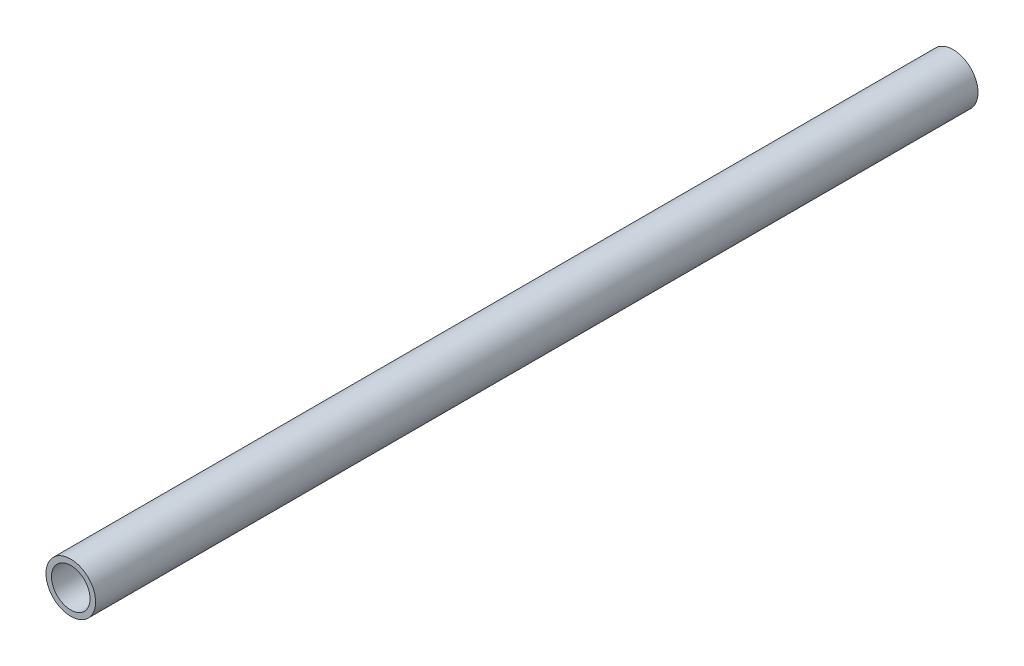
ISO-10303-21;
HEADER;
FILE_DESCRIPTION(('STEP AP214'),'2;1');
FILE_NAME('part.step','',(''),(''),'','','');
FILE_SCHEMA(('AUTOMOTIVE_DESIGN { 1 0 10303 214 1 1 1 1 }'));
ENDSEC;
DATA;
#1=APPLICATION_CONTEXT('core data for automotive mechanical design processes');
#2=APPLICATION_PROTOCOL_DEFINITION('international standard','automotive_design',2000,#1);
#3=PRODUCT_CONTEXT('',#1,'mechanical');
#4=PRODUCT('Part','Part','',(#3));
#5=PRODUCT_RELATED_PRODUCT_CATEGORY('part','',(#4));
#6=PRODUCT_DEFINITION_FORMATION('','',#4);
#7=PRODUCT_DEFINITION_CONTEXT('part definition',#1,'design');
#8=PRODUCT_DEFINITION('design','',#6,#7);
#9=PRODUCT_DEFINITION_SHAPE('','',#8);
#10=(LENGTH_UNIT() NAMED_UNIT(*) SI_UNIT(.MILLI.,.METRE.));
#11=(NAMED_UNIT(*) PLANE_ANGLE_UNIT() SI_UNIT($,.RADIAN.));
#12=(NAMED_UNIT(*) SI_UNIT($,.STERADIAN.) SOLID_ANGLE_UNIT());
#13=UNCERTAINTY_MEASURE_WITH_UNIT(LENGTH_MEASURE(1.E-05),#10,'distance_accuracy_value','');
#14=(GEOMETRIC_REPRESENTATION_CONTEXT(3) GLOBAL_UNCERTAINTY_ASSIGNED_CONTEXT((#13)) GLOBAL_UNIT_ASSIGNED_CONTEXT((#10,
#11,#12)) REPRESENTATION_CONTEXT('',''));
#15=CARTESIAN_POINT('',(0.,0.,0.));
#16=DIRECTION('',(0.,0.,1.));
#17=DIRECTION('',(1.,0.,0.));
#18=AXIS2_PLACEMENT_3D('',#15,#16,#17);
#19=CARTESIAN_POINT('',(0.,0.,320.02));
#20=DIRECTION('',(0.,0.,1.));
#21=DIRECTION('',(1.,0.,0.));
#22=AXIS2_PLACEMENT_3D('',#19,#20,#21);
#23=PLANE('',#22);
#24=CARTESIAN_POINT('',(0.,0.,320.02));
#25=DIRECTION('',(0.,0.,1.));
#26=DIRECTION('',(1.,0.,0.));
#27=AXIS2_PLACEMENT_3D('',#24,#25,#26);
#28=CIRCLE('',#27,9.);
#29=CARTESIAN_POINT('',(9.,0.,320.02));
#30=VERTEX_POINT('',#29);
#31=EDGE_CURVE('E10',#30,#30,#28,.T.);
#32=ORIENTED_EDGE('',*,*,#31,.T.);
#33=EDGE_LOOP('',(#32));
#34=FACE_BOUND('',#33,.T.);
#35=CARTESIAN_POINT('',(0.,0.,320.02));
#36=DIRECTION('',(0.,0.,1.));
#37=DIRECTION('',(1.,0.,0.));
#38=AXIS2_PLACEMENT_3D('',#35,#36,#37);
#39=CIRCLE('',#38,7.);
#40=CARTESIAN_POINT('',(7.,0.,320.02));
#41=VERTEX_POINT('',#40);
#42=EDGE_CURVE('E44',#41,#41,#39,.T.);
#43=ORIENTED_EDGE('',*,*,#42,.F.);
#44=EDGE_LOOP('',(#43));
#45=FACE_BOUND('',#44,.T.);
#46=ADVANCED_FACE('F33',(#34,#45),#23,.T.);
#47=CARTESIAN_POINT('',(0.,0.,0.));
#48=DIRECTION('',(0.,0.,1.));
#49=DIRECTION('',(1.,0.,0.));
#50=AXIS2_PLACEMENT_3D('',#47,#48,#49);
#51=PLANE('',#50);
#52=CARTESIAN_POINT('',(0.,0.,0.));
#53=DIRECTION('',(0.,0.,1.));
#54=DIRECTION('',(1.,0.,0.));
#55=AXIS2_PLACEMENT_3D('',#52,#53,#54);
#56=CIRCLE('',#55,9.);
#57=CARTESIAN_POINT('',(9.,0.,0.));
#58=VERTEX_POINT('',#57);
#59=EDGE_CURVE('E37',#58,#58,#56,.T.);
#60=ORIENTED_EDGE('',*,*,#59,.F.);
#61=EDGE_LOOP('',(#60));
#62=FACE_BOUND('',#61,.T.);
#63=CARTESIAN_POINT('',(0.,0.,0.));
#64=DIRECTION('',(0.,0.,1.));
#65=DIRECTION('',(1.,0.,0.));
#66=AXIS2_PLACEMENT_3D('',#63,#64,#65);
#67=CIRCLE('',#66,7.);
#68=CARTESIAN_POINT('',(7.,0.,0.));
#69=VERTEX_POINT('',#68);
#70=EDGE_CURVE('E46',#69,#69,#67,.T.);
#71=ORIENTED_EDGE('',*,*,#70,.T.);
#72=EDGE_LOOP('',(#71));
#73=FACE_BOUND('',#72,.T.);
#74=ADVANCED_FACE('F56',(#62,#73),#51,.F.);
#75=CARTESIAN_POINT('',(0.,0.,320.02));
#76=DIRECTION('',(0.,0.,-1.));
#77=DIRECTION('',(-1.,0.,0.));
#78=AXIS2_PLACEMENT_3D('',#75,#76,#77);
#79=CYLINDRICAL_SURFACE('',#78,9.);
#80=ORIENTED_EDGE('',*,*,#31,.F.);
#81=EDGE_LOOP('',(#80));
#82=FACE_BOUND('',#81,.T.);
#83=ORIENTED_EDGE('',*,*,#59,.T.);
#84=EDGE_LOOP('',(#83));
#85=FACE_BOUND('',#84,.T.);
#86=ADVANCED_FACE('F35',(#82,#85),#79,.T.);
#87=CARTESIAN_POINT('',(0.,0.,320.02));
#88=DIRECTION('',(0.,0.,-1.));
#89=DIRECTION('',(-1.,0.,0.));
#90=AXIS2_PLACEMENT_3D('',#87,#88,#89);
#91=CYLINDRICAL_SURFACE('',#90,7.);
#92=ORIENTED_EDGE('',*,*,#42,.T.);
#93=EDGE_LOOP('',(#92));
#94=FACE_BOUND('',#93,.T.);
#95=ORIENTED_EDGE('',*,*,#70,.F.);
#96=EDGE_LOOP('',(#95));
#97=FACE_BOUND('',#96,.T.);
#98=ADVANCED_FACE('F52',(#94,#97),#91,.F.);
#99=CLOSED_SHELL('',(#46,#74,#86,#98));
#100=MANIFOLD_SOLID_BREP('B2',#99);
#101=ADVANCED_BREP_SHAPE_REPRESENTATION('',(#18,#100),#14);
#102=SHAPE_DEFINITION_REPRESENTATION(#9,#101);
ENDSEC;
END-ISO-10303-21;
